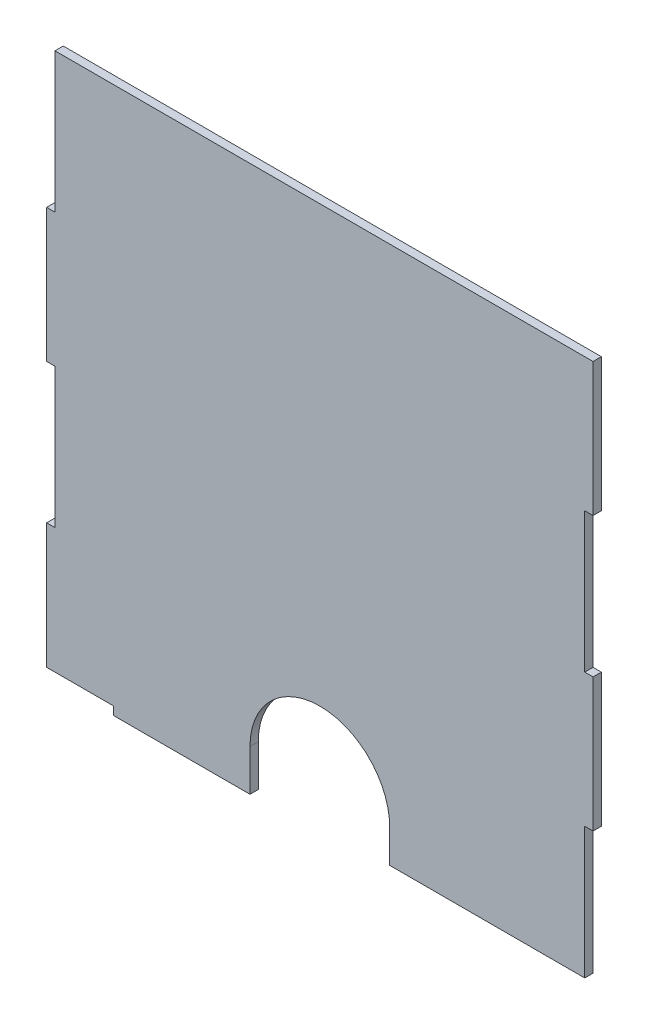
ISO-10303-21;
HEADER;
FILE_DESCRIPTION(('STEP AP214'),'2;1');
FILE_NAME('part.step','',(''),(''),'','','');
FILE_SCHEMA(('AUTOMOTIVE_DESIGN { 1 0 10303 214 1 1 1 1 }'));
ENDSEC;
DATA;
#1=APPLICATION_CONTEXT('core data for automotive mechanical design processes');
#2=APPLICATION_PROTOCOL_DEFINITION('international standard','automotive_design',2000,#1);
#3=PRODUCT_CONTEXT('',#1,'mechanical');
#4=PRODUCT('Part','Part','',(#3));
#5=PRODUCT_RELATED_PRODUCT_CATEGORY('part','',(#4));
#6=PRODUCT_DEFINITION_FORMATION('','',#4);
#7=PRODUCT_DEFINITION_CONTEXT('part definition',#1,'design');
#8=PRODUCT_DEFINITION('design','',#6,#7);
#9=PRODUCT_DEFINITION_SHAPE('','',#8);
#10=(LENGTH_UNIT() NAMED_UNIT(*) SI_UNIT(.MILLI.,.METRE.));
#11=(NAMED_UNIT(*) PLANE_ANGLE_UNIT() SI_UNIT($,.RADIAN.));
#12=(NAMED_UNIT(*) SI_UNIT($,.STERADIAN.) SOLID_ANGLE_UNIT());
#13=UNCERTAINTY_MEASURE_WITH_UNIT(LENGTH_MEASURE(1.E-05),#10,'distance_accuracy_value','');
#14=(GEOMETRIC_REPRESENTATION_CONTEXT(3) GLOBAL_UNCERTAINTY_ASSIGNED_CONTEXT((#13)) GLOBAL_UNIT_ASSIGNED_CONTEXT((#10,
#11,#12)) REPRESENTATION_CONTEXT('',''));
#15=CARTESIAN_POINT('',(0.,0.,0.));
#16=DIRECTION('',(0.,0.,1.));
#17=DIRECTION('',(1.,0.,0.));
#18=AXIS2_PLACEMENT_3D('',#15,#16,#17);
#19=CARTESIAN_POINT('',(0.,-167.5,6.));
#20=DIRECTION('',(0.,0.,-1.));
#21=DIRECTION('',(-1.,0.,0.));
#22=AXIS2_PLACEMENT_3D('',#19,#20,#21);
#23=CYLINDRICAL_SURFACE('',#22,50.4999999999999);
#24=CARTESIAN_POINT('',(0.,-167.5,0.));
#25=DIRECTION('',(0.,0.,1.));
#26=DIRECTION('',(1.,0.,0.));
#27=AXIS2_PLACEMENT_3D('',#24,#25,#26);
#28=CIRCLE('',#27,50.4999999999999);
#29=CARTESIAN_POINT('',(50.5,-167.5,0.));
#30=VERTEX_POINT('',#29);
#31=CARTESIAN_POINT('',(-50.5,-167.5,0.));
#32=VERTEX_POINT('',#31);
#33=EDGE_CURVE('E219',#30,#32,#28,.T.);
#34=ORIENTED_EDGE('',*,*,#33,.F.);
#35=DIRECTION('',(0.,0.,-1.));
#36=VECTOR('',#35,1.);
#37=CARTESIAN_POINT('',(50.5,-167.5,6.));
#38=LINE('',#37,#36);
#39=CARTESIAN_POINT('',(50.5,-167.5,6.));
#40=VERTEX_POINT('',#39);
#41=EDGE_CURVE('E11',#40,#30,#38,.T.);
#42=ORIENTED_EDGE('',*,*,#41,.F.);
#43=CARTESIAN_POINT('',(0.,-167.5,6.));
#44=DIRECTION('',(0.,0.,1.));
#45=DIRECTION('',(1.,0.,0.));
#46=AXIS2_PLACEMENT_3D('',#43,#44,#45);
#47=CIRCLE('',#46,50.4999999999999);
#48=CARTESIAN_POINT('',(-50.5,-167.5,6.));
#49=VERTEX_POINT('',#48);
#50=EDGE_CURVE('E272',#40,#49,#47,.T.);
#51=ORIENTED_EDGE('',*,*,#50,.T.);
#52=DIRECTION('',(0.,0.,-1.));
#53=VECTOR('',#52,1.);
#54=CARTESIAN_POINT('',(-50.5,-167.5,6.));
#55=LINE('',#54,#53);
#56=EDGE_CURVE('E133',#49,#32,#55,.T.);
#57=ORIENTED_EDGE('',*,*,#56,.T.);
#58=EDGE_LOOP('',(#34,#42,#51,#57));
#59=FACE_BOUND('',#58,.T.);
#60=ADVANCED_FACE('F41',(#59),#23,.F.);
#61=CARTESIAN_POINT('',(50.5,0.,6.));
#62=DIRECTION('',(-1.,0.,0.));
#63=DIRECTION('',(0.,0.,1.));
#64=AXIS2_PLACEMENT_3D('',#61,#62,#63);
#65=PLANE('',#64);
#66=DIRECTION('',(0.,1.,0.));
#67=VECTOR('',#66,1.);
#68=CARTESIAN_POINT('',(50.5,0.,0.));
#69=LINE('',#68,#67);
#70=CARTESIAN_POINT('',(50.5,-191.5,0.));
#71=VERTEX_POINT('',#70);
#72=EDGE_CURVE('E222',#71,#30,#69,.T.);
#73=ORIENTED_EDGE('',*,*,#72,.F.);
#74=DIRECTION('',(0.,0.,-1.));
#75=VECTOR('',#74,1.);
#76=CARTESIAN_POINT('',(50.5,-191.5,6.));
#77=LINE('',#76,#75);
#78=CARTESIAN_POINT('',(50.5,-191.5,6.));
#79=VERTEX_POINT('',#78);
#80=EDGE_CURVE('E49',#79,#71,#77,.T.);
#81=ORIENTED_EDGE('',*,*,#80,.F.);
#82=DIRECTION('',(0.,1.,0.));
#83=VECTOR('',#82,1.);
#84=CARTESIAN_POINT('',(50.5,0.,6.));
#85=LINE('',#84,#83);
#86=EDGE_CURVE('E325',#79,#40,#85,.T.);
#87=ORIENTED_EDGE('',*,*,#86,.T.);
#88=ORIENTED_EDGE('',*,*,#41,.T.);
#89=EDGE_LOOP('',(#73,#81,#87,#88));
#90=FACE_BOUND('',#89,.T.);
#91=ADVANCED_FACE('F324',(#90),#65,.T.);
#92=CARTESIAN_POINT('',(0.,-191.5,6.));
#93=DIRECTION('',(0.,1.,0.));
#94=DIRECTION('',(0.,0.,1.));
#95=AXIS2_PLACEMENT_3D('',#92,#93,#94);
#96=PLANE('',#95);
#97=DIRECTION('',(1.,0.,0.));
#98=VECTOR('',#97,1.);
#99=CARTESIAN_POINT('',(0.,-191.5,0.));
#100=LINE('',#99,#98);
#101=CARTESIAN_POINT('',(191.5,-191.5,0.));
#102=VERTEX_POINT('',#101);
#103=EDGE_CURVE('E225',#71,#102,#100,.T.);
#104=ORIENTED_EDGE('',*,*,#103,.T.);
#105=DIRECTION('',(0.,0.,-1.));
#106=VECTOR('',#105,1.);
#107=CARTESIAN_POINT('',(191.5,-191.5,6.));
#108=LINE('',#107,#106);
#109=CARTESIAN_POINT('',(191.5,-191.5,6.));
#110=VERTEX_POINT('',#109);
#111=EDGE_CURVE('E309',#110,#102,#108,.T.);
#112=ORIENTED_EDGE('',*,*,#111,.F.);
#113=DIRECTION('',(1.,0.,0.));
#114=VECTOR('',#113,1.);
#115=CARTESIAN_POINT('',(0.,-191.5,6.));
#116=LINE('',#115,#114);
#117=EDGE_CURVE('E316',#79,#110,#116,.T.);
#118=ORIENTED_EDGE('',*,*,#117,.F.);
#119=ORIENTED_EDGE('',*,*,#80,.T.);
#120=EDGE_LOOP('',(#104,#112,#118,#119));
#121=FACE_BOUND('',#120,.T.);
#122=ADVANCED_FACE('F314',(#121),#96,.F.);
#123=CARTESIAN_POINT('',(191.5,0.,6.));
#124=DIRECTION('',(-1.,0.,0.));
#125=DIRECTION('',(0.,0.,1.));
#126=AXIS2_PLACEMENT_3D('',#123,#124,#125);
#127=PLANE('',#126);
#128=DIRECTION('',(0.,1.,0.));
#129=VECTOR('',#128,1.);
#130=CARTESIAN_POINT('',(191.5,0.,0.));
#131=LINE('',#130,#129);
#132=CARTESIAN_POINT('',(191.5,-96.5,0.));
#133=VERTEX_POINT('',#132);
#134=EDGE_CURVE('E227',#102,#133,#131,.T.);
#135=ORIENTED_EDGE('',*,*,#134,.T.);
#136=DIRECTION('',(0.,0.,-1.));
#137=VECTOR('',#136,1.);
#138=CARTESIAN_POINT('',(191.5,-96.5,6.));
#139=LINE('',#138,#137);
#140=CARTESIAN_POINT('',(191.5,-96.5,6.));
#141=VERTEX_POINT('',#140);
#142=EDGE_CURVE('E307',#141,#133,#139,.T.);
#143=ORIENTED_EDGE('',*,*,#142,.F.);
#144=DIRECTION('',(0.,1.,0.));
#145=VECTOR('',#144,1.);
#146=CARTESIAN_POINT('',(191.5,0.,6.));
#147=LINE('',#146,#145);
#148=EDGE_CURVE('E333',#110,#141,#147,.T.);
#149=ORIENTED_EDGE('',*,*,#148,.F.);
#150=ORIENTED_EDGE('',*,*,#111,.T.);
#151=EDGE_LOOP('',(#135,#143,#149,#150));
#152=FACE_BOUND('',#151,.T.);
#153=ADVANCED_FACE('F400',(#152),#127,.F.);
#154=CARTESIAN_POINT('',(0.,-96.5,6.));
#155=DIRECTION('',(0.,-1.,0.));
#156=DIRECTION('',(0.,0.,-1.));
#157=AXIS2_PLACEMENT_3D('',#154,#155,#156);
#158=PLANE('',#157);
#159=DIRECTION('',(-1.,0.,0.));
#160=VECTOR('',#159,1.);
#161=CARTESIAN_POINT('',(0.,-96.5,0.));
#162=LINE('',#161,#160);
#163=CARTESIAN_POINT('',(197.5,-96.5,0.));
#164=VERTEX_POINT('',#163);
#165=EDGE_CURVE('E230',#164,#133,#162,.T.);
#166=ORIENTED_EDGE('',*,*,#165,.F.);
#167=DIRECTION('',(0.,0.,-1.));
#168=VECTOR('',#167,1.);
#169=CARTESIAN_POINT('',(197.5,-96.5,6.));
#170=LINE('',#169,#168);
#171=CARTESIAN_POINT('',(197.5,-96.5,6.));
#172=VERTEX_POINT('',#171);
#173=EDGE_CURVE('E305',#172,#164,#170,.T.);
#174=ORIENTED_EDGE('',*,*,#173,.F.);
#175=DIRECTION('',(-1.,0.,0.));
#176=VECTOR('',#175,1.);
#177=CARTESIAN_POINT('',(0.,-96.5,6.));
#178=LINE('',#177,#176);
#179=EDGE_CURVE('E335',#172,#141,#178,.T.);
#180=ORIENTED_EDGE('',*,*,#179,.T.);
#181=ORIENTED_EDGE('',*,*,#142,.T.);
#182=EDGE_LOOP('',(#166,#174,#180,#181));
#183=FACE_BOUND('',#182,.T.);
#184=ADVANCED_FACE('F405',(#183),#158,.T.);
#185=CARTESIAN_POINT('',(197.5,0.,6.));
#186=DIRECTION('',(-1.,0.,0.));
#187=DIRECTION('',(0.,0.,1.));
#188=AXIS2_PLACEMENT_3D('',#185,#186,#187);
#189=PLANE('',#188);
#190=DIRECTION('',(0.,1.,0.));
#191=VECTOR('',#190,1.);
#192=CARTESIAN_POINT('',(197.5,0.,0.));
#193=LINE('',#192,#191);
#194=CARTESIAN_POINT('',(197.5,0.,0.));
#195=VERTEX_POINT('',#194);
#196=EDGE_CURVE('E233',#164,#195,#193,.T.);
#197=ORIENTED_EDGE('',*,*,#196,.T.);
#198=DIRECTION('',(0.,0.,-1.));
#199=VECTOR('',#198,1.);
#200=CARTESIAN_POINT('',(197.5,0.,6.));
#201=LINE('',#200,#199);
#202=CARTESIAN_POINT('',(197.5,0.,6.));
#203=VERTEX_POINT('',#202);
#204=EDGE_CURVE('E302',#203,#195,#201,.T.);
#205=ORIENTED_EDGE('',*,*,#204,.F.);
#206=DIRECTION('',(0.,1.,0.));
#207=VECTOR('',#206,1.);
#208=CARTESIAN_POINT('',(197.5,0.,6.));
#209=LINE('',#208,#207);
#210=EDGE_CURVE('E338',#172,#203,#209,.T.);
#211=ORIENTED_EDGE('',*,*,#210,.F.);
#212=ORIENTED_EDGE('',*,*,#173,.T.);
#213=EDGE_LOOP('',(#197,#205,#211,#212));
#214=FACE_BOUND('',#213,.T.);
#215=ADVANCED_FACE('F409',(#214),#189,.F.);
#216=CARTESIAN_POINT('',(0.,0.,6.));
#217=DIRECTION('',(0.,-1.,0.));
#218=DIRECTION('',(0.,0.,-1.));
#219=AXIS2_PLACEMENT_3D('',#216,#217,#218);
#220=PLANE('',#219);
#221=DIRECTION('',(-1.,0.,0.));
#222=VECTOR('',#221,1.);
#223=CARTESIAN_POINT('',(0.,0.,0.));
#224=LINE('',#223,#222);
#225=CARTESIAN_POINT('',(191.5,0.,0.));
#226=VERTEX_POINT('',#225);
#227=EDGE_CURVE('E235',#195,#226,#224,.T.);
#228=ORIENTED_EDGE('',*,*,#227,.T.);
#229=DIRECTION('',(0.,0.,-1.));
#230=VECTOR('',#229,1.);
#231=CARTESIAN_POINT('',(191.5,0.,6.));
#232=LINE('',#231,#230);
#233=CARTESIAN_POINT('',(191.5,0.,6.));
#234=VERTEX_POINT('',#233);
#235=EDGE_CURVE('E299',#234,#226,#232,.T.);
#236=ORIENTED_EDGE('',*,*,#235,.F.);
#237=DIRECTION('',(-1.,0.,0.));
#238=VECTOR('',#237,1.);
#239=CARTESIAN_POINT('',(0.,0.,6.));
#240=LINE('',#239,#238);
#241=EDGE_CURVE('E340',#203,#234,#240,.T.);
#242=ORIENTED_EDGE('',*,*,#241,.F.);
#243=ORIENTED_EDGE('',*,*,#204,.T.);
#244=EDGE_LOOP('',(#228,#236,#242,#243));
#245=FACE_BOUND('',#244,.T.);
#246=ADVANCED_FACE('F411',(#245),#220,.F.);
#247=CARTESIAN_POINT('',(191.5,0.,6.));
#248=DIRECTION('',(-1.,0.,0.));
#249=DIRECTION('',(0.,0.,1.));
#250=AXIS2_PLACEMENT_3D('',#247,#248,#249);
#251=PLANE('',#250);
#252=DIRECTION('',(0.,1.,0.));
#253=VECTOR('',#252,1.);
#254=CARTESIAN_POINT('',(191.5,0.,0.));
#255=LINE('',#254,#253);
#256=CARTESIAN_POINT('',(191.5,101.,0.));
#257=VERTEX_POINT('',#256);
#258=EDGE_CURVE('E238',#226,#257,#255,.T.);
#259=ORIENTED_EDGE('',*,*,#258,.T.);
#260=DIRECTION('',(0.,0.,-1.));
#261=VECTOR('',#260,1.);
#262=CARTESIAN_POINT('',(191.5,101.,6.));
#263=LINE('',#262,#261);
#264=CARTESIAN_POINT('',(191.5,101.,6.));
#265=VERTEX_POINT('',#264);
#266=EDGE_CURVE('E297',#265,#257,#263,.T.);
#267=ORIENTED_EDGE('',*,*,#266,.F.);
#268=DIRECTION('',(0.,1.,0.));
#269=VECTOR('',#268,1.);
#270=CARTESIAN_POINT('',(191.5,0.,6.));
#271=LINE('',#270,#269);
#272=EDGE_CURVE('E343',#234,#265,#271,.T.);
#273=ORIENTED_EDGE('',*,*,#272,.F.);
#274=ORIENTED_EDGE('',*,*,#235,.T.);
#275=EDGE_LOOP('',(#259,#267,#273,#274));
#276=FACE_BOUND('',#275,.T.);
#277=ADVANCED_FACE('F414',(#276),#251,.F.);
#278=CARTESIAN_POINT('',(0.,101.,6.));
#279=DIRECTION('',(0.,-1.,0.));
#280=DIRECTION('',(0.,0.,-1.));
#281=AXIS2_PLACEMENT_3D('',#278,#279,#280);
#282=PLANE('',#281);
#283=DIRECTION('',(-1.,0.,0.));
#284=VECTOR('',#283,1.);
#285=CARTESIAN_POINT('',(0.,101.,0.));
#286=LINE('',#285,#284);
#287=CARTESIAN_POINT('',(197.5,101.,0.));
#288=VERTEX_POINT('',#287);
#289=EDGE_CURVE('E241',#288,#257,#286,.T.);
#290=ORIENTED_EDGE('',*,*,#289,.F.);
#291=DIRECTION('',(0.,0.,-1.));
#292=VECTOR('',#291,1.);
#293=CARTESIAN_POINT('',(197.5,101.,6.));
#294=LINE('',#293,#292);
#295=CARTESIAN_POINT('',(197.5,101.,6.));
#296=VERTEX_POINT('',#295);
#297=EDGE_CURVE('E295',#296,#288,#294,.T.);
#298=ORIENTED_EDGE('',*,*,#297,.F.);
#299=DIRECTION('',(-1.,0.,0.));
#300=VECTOR('',#299,1.);
#301=CARTESIAN_POINT('',(0.,101.,6.));
#302=LINE('',#301,#300);
#303=EDGE_CURVE('E345',#296,#265,#302,.T.);
#304=ORIENTED_EDGE('',*,*,#303,.T.);
#305=ORIENTED_EDGE('',*,*,#266,.T.);
#306=EDGE_LOOP('',(#290,#298,#304,#305));
#307=FACE_BOUND('',#306,.T.);
#308=ADVANCED_FACE('F418',(#307),#282,.T.);
#309=CARTESIAN_POINT('',(197.5,197.5,0.));
#310=VERTEX_POINT('',#309);
#311=EDGE_CURVE('E236',#288,#310,#193,.T.);
#312=ORIENTED_EDGE('',*,*,#311,.T.);
#313=DIRECTION('',(0.,0.,-1.));
#314=VECTOR('',#313,1.);
#315=CARTESIAN_POINT('',(197.5,197.5,6.));
#316=LINE('',#315,#314);
#317=CARTESIAN_POINT('',(197.5,197.5,6.));
#318=VERTEX_POINT('',#317);
#319=EDGE_CURVE('E293',#318,#310,#316,.T.);
#320=ORIENTED_EDGE('',*,*,#319,.F.);
#321=EDGE_CURVE('E341',#296,#318,#209,.T.);
#322=ORIENTED_EDGE('',*,*,#321,.F.);
#323=ORIENTED_EDGE('',*,*,#297,.T.);
#324=EDGE_LOOP('',(#312,#320,#322,#323));
#325=FACE_BOUND('',#324,.T.);
#326=ADVANCED_FACE('F422',(#325),#189,.F.);
#327=CARTESIAN_POINT('',(0.,197.5,6.));
#328=DIRECTION('',(0.,1.,0.));
#329=DIRECTION('',(0.,0.,1.));
#330=AXIS2_PLACEMENT_3D('',#327,#328,#329);
#331=PLANE('',#330);
#332=DIRECTION('',(1.,0.,0.));
#333=VECTOR('',#332,1.);
#334=CARTESIAN_POINT('',(0.,197.5,0.));
#335=LINE('',#334,#333);
#336=CARTESIAN_POINT('',(-191.5,197.5,0.));
#337=VERTEX_POINT('',#336);
#338=EDGE_CURVE('E244',#337,#310,#335,.T.);
#339=ORIENTED_EDGE('',*,*,#338,.F.);
#340=DIRECTION('',(0.,0.,-1.));
#341=VECTOR('',#340,1.);
#342=CARTESIAN_POINT('',(-191.5,197.5,6.));
#343=LINE('',#342,#341);
#344=CARTESIAN_POINT('',(-191.5,197.5,6.));
#345=VERTEX_POINT('',#344);
#346=EDGE_CURVE('E291',#345,#337,#343,.T.);
#347=ORIENTED_EDGE('',*,*,#346,.F.);
#348=DIRECTION('',(1.,0.,0.));
#349=VECTOR('',#348,1.);
#350=CARTESIAN_POINT('',(0.,197.5,6.));
#351=LINE('',#350,#349);
#352=EDGE_CURVE('E348',#345,#318,#351,.T.);
#353=ORIENTED_EDGE('',*,*,#352,.T.);
#354=ORIENTED_EDGE('',*,*,#319,.T.);
#355=EDGE_LOOP('',(#339,#347,#353,#354));
#356=FACE_BOUND('',#355,.T.);
#357=ADVANCED_FACE('F426',(#356),#331,.T.);
#358=CARTESIAN_POINT('',(-191.5,0.,6.));
#359=DIRECTION('',(1.,0.,0.));
#360=DIRECTION('',(0.,1.,0.));
#361=AXIS2_PLACEMENT_3D('',#358,#359,#360);
#362=PLANE('',#361);
#363=DIRECTION('',(0.,-1.,0.));
#364=VECTOR('',#363,1.);
#365=CARTESIAN_POINT('',(-191.5,0.,0.));
#366=LINE('',#365,#364);
#367=CARTESIAN_POINT('',(-191.5,96.4999999999999,0.));
#368=VERTEX_POINT('',#367);
#369=EDGE_CURVE('E247',#337,#368,#366,.T.);
#370=ORIENTED_EDGE('',*,*,#369,.T.);
#371=DIRECTION('',(0.,0.,-1.));
#372=VECTOR('',#371,1.);
#373=CARTESIAN_POINT('',(-191.5,96.4999999999999,6.));
#374=LINE('',#373,#372);
#375=CARTESIAN_POINT('',(-191.5,96.4999999999999,6.));
#376=VERTEX_POINT('',#375);
#377=EDGE_CURVE('E289',#376,#368,#374,.T.);
#378=ORIENTED_EDGE('',*,*,#377,.F.);
#379=DIRECTION('',(0.,-1.,0.));
#380=VECTOR('',#379,1.);
#381=CARTESIAN_POINT('',(-191.5,0.,6.));
#382=LINE('',#381,#380);
#383=EDGE_CURVE('E351',#345,#376,#382,.T.);
#384=ORIENTED_EDGE('',*,*,#383,.F.);
#385=ORIENTED_EDGE('',*,*,#346,.T.);
#386=EDGE_LOOP('',(#370,#378,#384,#385));
#387=FACE_BOUND('',#386,.T.);
#388=ADVANCED_FACE('F430',(#387),#362,.F.);
#389=CARTESIAN_POINT('',(0.,96.4999999999999,6.));
#390=DIRECTION('',(0.,1.,0.));
#391=DIRECTION('',(0.,0.,1.));
#392=AXIS2_PLACEMENT_3D('',#389,#390,#391);
#393=PLANE('',#392);
#394=DIRECTION('',(1.,0.,0.));
#395=VECTOR('',#394,1.);
#396=CARTESIAN_POINT('',(0.,96.4999999999999,0.));
#397=LINE('',#396,#395);
#398=CARTESIAN_POINT('',(-197.5,96.4999999999999,0.));
#399=VERTEX_POINT('',#398);
#400=EDGE_CURVE('E250',#399,#368,#397,.T.);
#401=ORIENTED_EDGE('',*,*,#400,.F.);
#402=DIRECTION('',(0.,0.,-1.));
#403=VECTOR('',#402,1.);
#404=CARTESIAN_POINT('',(-197.5,96.4999999999999,6.));
#405=LINE('',#404,#403);
#406=CARTESIAN_POINT('',(-197.5,96.4999999999999,6.));
#407=VERTEX_POINT('',#406);
#408=EDGE_CURVE('E287',#407,#399,#405,.T.);
#409=ORIENTED_EDGE('',*,*,#408,.F.);
#410=DIRECTION('',(1.,0.,0.));
#411=VECTOR('',#410,1.);
#412=CARTESIAN_POINT('',(0.,96.4999999999999,6.));
#413=LINE('',#412,#411);
#414=EDGE_CURVE('E353',#407,#376,#413,.T.);
#415=ORIENTED_EDGE('',*,*,#414,.T.);
#416=ORIENTED_EDGE('',*,*,#377,.T.);
#417=EDGE_LOOP('',(#401,#409,#415,#416));
#418=FACE_BOUND('',#417,.T.);
#419=ADVANCED_FACE('F434',(#418),#393,.T.);
#420=CARTESIAN_POINT('',(-197.5,0.,6.));
#421=DIRECTION('',(-1.,0.,0.));
#422=DIRECTION('',(0.,0.,1.));
#423=AXIS2_PLACEMENT_3D('',#420,#421,#422);
#424=PLANE('',#423);
#425=DIRECTION('',(0.,1.,0.));
#426=VECTOR('',#425,1.);
#427=CARTESIAN_POINT('',(-197.5,0.,0.));
#428=LINE('',#427,#426);
#429=CARTESIAN_POINT('',(-197.5,0.,0.));
#430=VERTEX_POINT('',#429);
#431=EDGE_CURVE('E253',#430,#399,#428,.T.);
#432=ORIENTED_EDGE('',*,*,#431,.F.);
#433=DIRECTION('',(0.,0.,-1.));
#434=VECTOR('',#433,1.);
#435=CARTESIAN_POINT('',(-197.5,0.,6.));
#436=LINE('',#435,#434);
#437=CARTESIAN_POINT('',(-197.5,0.,6.));
#438=VERTEX_POINT('',#437);
#439=EDGE_CURVE('E285',#438,#430,#436,.T.);
#440=ORIENTED_EDGE('',*,*,#439,.F.);
#441=DIRECTION('',(0.,1.,0.));
#442=VECTOR('',#441,1.);
#443=CARTESIAN_POINT('',(-197.5,0.,6.));
#444=LINE('',#443,#442);
#445=EDGE_CURVE('E356',#438,#407,#444,.T.);
#446=ORIENTED_EDGE('',*,*,#445,.T.);
#447=ORIENTED_EDGE('',*,*,#408,.T.);
#448=EDGE_LOOP('',(#432,#440,#446,#447));
#449=FACE_BOUND('',#448,.T.);
#450=ADVANCED_FACE('F392',(#449),#424,.T.);
#451=CARTESIAN_POINT('',(0.,0.,6.));
#452=DIRECTION('',(0.,1.,0.));
#453=DIRECTION('',(0.,0.,1.));
#454=AXIS2_PLACEMENT_3D('',#451,#452,#453);
#455=PLANE('',#454);
#456=DIRECTION('',(1.,0.,0.));
#457=VECTOR('',#456,1.);
#458=CARTESIAN_POINT('',(0.,0.,0.));
#459=LINE('',#458,#457);
#460=CARTESIAN_POINT('',(-191.5,0.,0.));
#461=VERTEX_POINT('',#460);
#462=EDGE_CURVE('E256',#430,#461,#459,.T.);
#463=ORIENTED_EDGE('',*,*,#462,.T.);
#464=DIRECTION('',(0.,0.,-1.));
#465=VECTOR('',#464,1.);
#466=CARTESIAN_POINT('',(-191.5,0.,6.));
#467=LINE('',#466,#465);
#468=CARTESIAN_POINT('',(-191.5,0.,6.));
#469=VERTEX_POINT('',#468);
#470=EDGE_CURVE('E282',#469,#461,#467,.T.);
#471=ORIENTED_EDGE('',*,*,#470,.F.);
#472=DIRECTION('',(1.,0.,0.));
#473=VECTOR('',#472,1.);
#474=CARTESIAN_POINT('',(0.,0.,6.));
#475=LINE('',#474,#473);
#476=EDGE_CURVE('E359',#438,#469,#475,.T.);
#477=ORIENTED_EDGE('',*,*,#476,.F.);
#478=ORIENTED_EDGE('',*,*,#439,.T.);
#479=EDGE_LOOP('',(#463,#471,#477,#478));
#480=FACE_BOUND('',#479,.T.);
#481=ADVANCED_FACE('F439',(#480),#455,.F.);
#482=CARTESIAN_POINT('',(-191.5,0.,6.));
#483=DIRECTION('',(1.,0.,0.));
#484=DIRECTION('',(0.,0.,-1.));
#485=AXIS2_PLACEMENT_3D('',#482,#483,#484);
#486=PLANE('',#485);
#487=DIRECTION('',(0.,-1.,0.));
#488=VECTOR('',#487,1.);
#489=CARTESIAN_POINT('',(-191.5,0.,0.));
#490=LINE('',#489,#488);
#491=CARTESIAN_POINT('',(-191.5,-101.,0.));
#492=VERTEX_POINT('',#491);
#493=EDGE_CURVE('E259',#461,#492,#490,.T.);
#494=ORIENTED_EDGE('',*,*,#493,.T.);
#495=DIRECTION('',(0.,0.,-1.));
#496=VECTOR('',#495,1.);
#497=CARTESIAN_POINT('',(-191.5,-101.,6.));
#498=LINE('',#497,#496);
#499=CARTESIAN_POINT('',(-191.5,-101.,6.));
#500=VERTEX_POINT('',#499);
#501=EDGE_CURVE('E280',#500,#492,#498,.T.);
#502=ORIENTED_EDGE('',*,*,#501,.F.);
#503=DIRECTION('',(0.,-1.,0.));
#504=VECTOR('',#503,1.);
#505=CARTESIAN_POINT('',(-191.5,0.,6.));
#506=LINE('',#505,#504);
#507=EDGE_CURVE('E361',#469,#500,#506,.T.);
#508=ORIENTED_EDGE('',*,*,#507,.F.);
#509=ORIENTED_EDGE('',*,*,#470,.T.);
#510=EDGE_LOOP('',(#494,#502,#508,#509));
#511=FACE_BOUND('',#510,.T.);
#512=ADVANCED_FACE('F377',(#511),#486,.F.);
#513=CARTESIAN_POINT('',(0.,-101.,6.));
#514=DIRECTION('',(0.,1.,0.));
#515=DIRECTION('',(0.,0.,1.));
#516=AXIS2_PLACEMENT_3D('',#513,#514,#515);
#517=PLANE('',#516);
#518=DIRECTION('',(1.,0.,0.));
#519=VECTOR('',#518,1.);
#520=CARTESIAN_POINT('',(0.,-101.,0.));
#521=LINE('',#520,#519);
#522=CARTESIAN_POINT('',(-197.5,-101.,0.));
#523=VERTEX_POINT('',#522);
#524=EDGE_CURVE('E262',#523,#492,#521,.T.);
#525=ORIENTED_EDGE('',*,*,#524,.F.);
#526=DIRECTION('',(0.,0.,-1.));
#527=VECTOR('',#526,1.);
#528=CARTESIAN_POINT('',(-197.5,-101.,6.));
#529=LINE('',#528,#527);
#530=CARTESIAN_POINT('',(-197.5,-101.,6.));
#531=VERTEX_POINT('',#530);
#532=EDGE_CURVE('E278',#531,#523,#529,.T.);
#533=ORIENTED_EDGE('',*,*,#532,.F.);
#534=DIRECTION('',(1.,0.,0.));
#535=VECTOR('',#534,1.);
#536=CARTESIAN_POINT('',(0.,-101.,6.));
#537=LINE('',#536,#535);
#538=EDGE_CURVE('E362',#531,#500,#537,.T.);
#539=ORIENTED_EDGE('',*,*,#538,.T.);
#540=ORIENTED_EDGE('',*,*,#501,.T.);
#541=EDGE_LOOP('',(#525,#533,#539,#540));
#542=FACE_BOUND('',#541,.T.);
#543=ADVANCED_FACE('F379',(#542),#517,.T.);
#544=CARTESIAN_POINT('',(-197.5,-191.5,0.));
#545=VERTEX_POINT('',#544);
#546=EDGE_CURVE('E257',#545,#523,#428,.T.);
#547=ORIENTED_EDGE('',*,*,#546,.F.);
#548=DIRECTION('',(0.,0.,-1.));
#549=VECTOR('',#548,1.);
#550=CARTESIAN_POINT('',(-197.5,-191.5,6.));
#551=LINE('',#550,#549);
#552=CARTESIAN_POINT('',(-197.5,-191.5,6.));
#553=VERTEX_POINT('',#552);
#554=EDGE_CURVE('E276',#553,#545,#551,.T.);
#555=ORIENTED_EDGE('',*,*,#554,.F.);
#556=EDGE_CURVE('E214',#553,#531,#444,.T.);
#557=ORIENTED_EDGE('',*,*,#556,.T.);
#558=ORIENTED_EDGE('',*,*,#532,.T.);
#559=EDGE_LOOP('',(#547,#555,#557,#558));
#560=FACE_BOUND('',#559,.T.);
#561=ADVANCED_FACE('F369',(#560),#424,.T.);
#562=CARTESIAN_POINT('',(0.,-191.5,6.));
#563=DIRECTION('',(0.,1.,0.));
#564=DIRECTION('',(0.,0.,1.));
#565=AXIS2_PLACEMENT_3D('',#562,#563,#564);
#566=PLANE('',#565);
#567=DIRECTION('',(1.,0.,0.));
#568=VECTOR('',#567,1.);
#569=CARTESIAN_POINT('',(0.,-191.5,0.));
#570=LINE('',#569,#568);
#571=CARTESIAN_POINT('',(-149.,-191.5,0.));
#572=VERTEX_POINT('',#571);
#573=EDGE_CURVE('E265',#545,#572,#570,.T.);
#574=ORIENTED_EDGE('',*,*,#573,.T.);
#575=DIRECTION('',(0.,0.,-1.));
#576=VECTOR('',#575,1.);
#577=CARTESIAN_POINT('',(-149.,-191.5,6.));
#578=LINE('',#577,#576);
#579=CARTESIAN_POINT('',(-149.,-191.5,6.));
#580=VERTEX_POINT('',#579);
#581=EDGE_CURVE('E202',#580,#572,#578,.T.);
#582=ORIENTED_EDGE('',*,*,#581,.F.);
#583=DIRECTION('',(1.,0.,0.));
#584=VECTOR('',#583,1.);
#585=CARTESIAN_POINT('',(0.,-191.5,6.));
#586=LINE('',#585,#584);
#587=EDGE_CURVE('E211',#553,#580,#586,.T.);
#588=ORIENTED_EDGE('',*,*,#587,.F.);
#589=ORIENTED_EDGE('',*,*,#554,.T.);
#590=EDGE_LOOP('',(#574,#582,#588,#589));
#591=FACE_BOUND('',#590,.T.);
#592=ADVANCED_FACE('F383',(#591),#566,.F.);
#593=CARTESIAN_POINT('',(-149.,0.,6.));
#594=DIRECTION('',(-1.,0.,0.));
#595=DIRECTION('',(0.,0.,1.));
#596=AXIS2_PLACEMENT_3D('',#593,#594,#595);
#597=PLANE('',#596);
#598=DIRECTION('',(0.,1.,0.));
#599=VECTOR('',#598,1.);
#600=CARTESIAN_POINT('',(-149.,0.,0.));
#601=LINE('',#600,#599);
#602=CARTESIAN_POINT('',(-149.,-197.5,0.));
#603=VERTEX_POINT('',#602);
#604=EDGE_CURVE('E201',#603,#572,#601,.T.);
#605=ORIENTED_EDGE('',*,*,#604,.F.);
#606=DIRECTION('',(0.,0.,-1.));
#607=VECTOR('',#606,1.);
#608=CARTESIAN_POINT('',(-149.,-197.5,6.));
#609=LINE('',#608,#607);
#610=CARTESIAN_POINT('',(-149.,-197.5,6.));
#611=VERTEX_POINT('',#610);
#612=EDGE_CURVE('E195',#611,#603,#609,.T.);
#613=ORIENTED_EDGE('',*,*,#612,.F.);
#614=DIRECTION('',(0.,1.,0.));
#615=VECTOR('',#614,1.);
#616=CARTESIAN_POINT('',(-149.,0.,6.));
#617=LINE('',#616,#615);
#618=EDGE_CURVE('E199',#611,#580,#617,.T.);
#619=ORIENTED_EDGE('',*,*,#618,.T.);
#620=ORIENTED_EDGE('',*,*,#581,.T.);
#621=EDGE_LOOP('',(#605,#613,#619,#620));
#622=FACE_BOUND('',#621,.T.);
#623=ADVANCED_FACE('F197',(#622),#597,.T.);
#624=CARTESIAN_POINT('',(0.,-197.5,6.));
#625=DIRECTION('',(0.,1.,0.));
#626=DIRECTION('',(0.,0.,1.));
#627=AXIS2_PLACEMENT_3D('',#624,#625,#626);
#628=PLANE('',#627);
#629=DIRECTION('',(1.,0.,0.));
#630=VECTOR('',#629,1.);
#631=CARTESIAN_POINT('',(0.,-197.5,0.));
#632=LINE('',#631,#630);
#633=CARTESIAN_POINT('',(-50.5,-197.5,0.));
#634=VERTEX_POINT('',#633);
#635=EDGE_CURVE('E126',#603,#634,#632,.T.);
#636=ORIENTED_EDGE('',*,*,#635,.T.);
#637=DIRECTION('',(0.,0.,-1.));
#638=VECTOR('',#637,1.);
#639=CARTESIAN_POINT('',(-50.5,-197.5,6.));
#640=LINE('',#639,#638);
#641=CARTESIAN_POINT('',(-50.5,-197.5,6.));
#642=VERTEX_POINT('',#641);
#643=EDGE_CURVE('E203',#642,#634,#640,.T.);
#644=ORIENTED_EDGE('',*,*,#643,.F.);
#645=DIRECTION('',(1.,0.,0.));
#646=VECTOR('',#645,1.);
#647=CARTESIAN_POINT('',(0.,-197.5,6.));
#648=LINE('',#647,#646);
#649=EDGE_CURVE('E205',#611,#642,#648,.T.);
#650=ORIENTED_EDGE('',*,*,#649,.F.);
#651=ORIENTED_EDGE('',*,*,#612,.T.);
#652=EDGE_LOOP('',(#636,#644,#650,#651));
#653=FACE_BOUND('',#652,.T.);
#654=ADVANCED_FACE('F206',(#653),#628,.F.);
#655=CARTESIAN_POINT('',(-50.5,0.,6.));
#656=DIRECTION('',(-1.,0.,0.));
#657=DIRECTION('',(0.,0.,1.));
#658=AXIS2_PLACEMENT_3D('',#655,#656,#657);
#659=PLANE('',#658);
#660=DIRECTION('',(0.,1.,0.));
#661=VECTOR('',#660,1.);
#662=CARTESIAN_POINT('',(-50.5,0.,0.));
#663=LINE('',#662,#661);
#664=EDGE_CURVE('E270',#634,#32,#663,.T.);
#665=ORIENTED_EDGE('',*,*,#664,.T.);
#666=ORIENTED_EDGE('',*,*,#56,.F.);
#667=DIRECTION('',(0.,1.,0.));
#668=VECTOR('',#667,1.);
#669=CARTESIAN_POINT('',(-50.5,0.,6.));
#670=LINE('',#669,#668);
#671=EDGE_CURVE('E57',#642,#49,#670,.T.);
#672=ORIENTED_EDGE('',*,*,#671,.F.);
#673=ORIENTED_EDGE('',*,*,#643,.T.);
#674=EDGE_LOOP('',(#665,#666,#672,#673));
#675=FACE_BOUND('',#674,.T.);
#676=ADVANCED_FACE('F328',(#675),#659,.F.);
#677=CARTESIAN_POINT('',(0.,0.,6.));
#678=DIRECTION('',(0.,0.,1.));
#679=DIRECTION('',(1.,0.,0.));
#680=AXIS2_PLACEMENT_3D('',#677,#678,#679);
#681=PLANE('',#680);
#682=ORIENTED_EDGE('',*,*,#50,.F.);
#683=ORIENTED_EDGE('',*,*,#86,.F.);
#684=ORIENTED_EDGE('',*,*,#117,.T.);
#685=ORIENTED_EDGE('',*,*,#148,.T.);
#686=ORIENTED_EDGE('',*,*,#179,.F.);
#687=ORIENTED_EDGE('',*,*,#210,.T.);
#688=ORIENTED_EDGE('',*,*,#241,.T.);
#689=ORIENTED_EDGE('',*,*,#272,.T.);
#690=ORIENTED_EDGE('',*,*,#303,.F.);
#691=ORIENTED_EDGE('',*,*,#321,.T.);
#692=ORIENTED_EDGE('',*,*,#352,.F.);
#693=ORIENTED_EDGE('',*,*,#383,.T.);
#694=ORIENTED_EDGE('',*,*,#414,.F.);
#695=ORIENTED_EDGE('',*,*,#445,.F.);
#696=ORIENTED_EDGE('',*,*,#476,.T.);
#697=ORIENTED_EDGE('',*,*,#507,.T.);
#698=ORIENTED_EDGE('',*,*,#538,.F.);
#699=ORIENTED_EDGE('',*,*,#556,.F.);
#700=ORIENTED_EDGE('',*,*,#587,.T.);
#701=ORIENTED_EDGE('',*,*,#618,.F.);
#702=ORIENTED_EDGE('',*,*,#649,.T.);
#703=ORIENTED_EDGE('',*,*,#671,.T.);
#704=EDGE_LOOP('',(#682,#683,#684,#685,#686,#687,#688,#689,#690,#691,#692,#693,#694,#695,#696,
#697,#698,#699,#700,#701,#702,#703));
#705=FACE_BOUND('',#704,.T.);
#706=ADVANCED_FACE('F208',(#705),#681,.T.);
#707=CARTESIAN_POINT('',(0.,0.,0.));
#708=DIRECTION('',(0.,0.,1.));
#709=DIRECTION('',(1.,0.,0.));
#710=AXIS2_PLACEMENT_3D('',#707,#708,#709);
#711=PLANE('',#710);
#712=ORIENTED_EDGE('',*,*,#33,.T.);
#713=ORIENTED_EDGE('',*,*,#664,.F.);
#714=ORIENTED_EDGE('',*,*,#635,.F.);
#715=ORIENTED_EDGE('',*,*,#604,.T.);
#716=ORIENTED_EDGE('',*,*,#573,.F.);
#717=ORIENTED_EDGE('',*,*,#546,.T.);
#718=ORIENTED_EDGE('',*,*,#524,.T.);
#719=ORIENTED_EDGE('',*,*,#493,.F.);
#720=ORIENTED_EDGE('',*,*,#462,.F.);
#721=ORIENTED_EDGE('',*,*,#431,.T.);
#722=ORIENTED_EDGE('',*,*,#400,.T.);
#723=ORIENTED_EDGE('',*,*,#369,.F.);
#724=ORIENTED_EDGE('',*,*,#338,.T.);
#725=ORIENTED_EDGE('',*,*,#311,.F.);
#726=ORIENTED_EDGE('',*,*,#289,.T.);
#727=ORIENTED_EDGE('',*,*,#258,.F.);
#728=ORIENTED_EDGE('',*,*,#227,.F.);
#729=ORIENTED_EDGE('',*,*,#196,.F.);
#730=ORIENTED_EDGE('',*,*,#165,.T.);
#731=ORIENTED_EDGE('',*,*,#134,.F.);
#732=ORIENTED_EDGE('',*,*,#103,.F.);
#733=ORIENTED_EDGE('',*,*,#72,.T.);
#734=EDGE_LOOP('',(#712,#713,#714,#715,#716,#717,#718,#719,#720,#721,#722,#723,#724,#725,#726,
#727,#728,#729,#730,#731,#732,#733));
#735=FACE_BOUND('',#734,.T.);
#736=ADVANCED_FACE('F323',(#735),#711,.F.);
#737=CLOSED_SHELL('',(#60,#91,#122,#153,#184,#215,#246,#277,#308,#326,#357,#388,#419,#450,#481,
#512,#543,#561,#592,#623,#654,#676,#706,#736));
#738=MANIFOLD_SOLID_BREP('B2',#737);
#739=ADVANCED_BREP_SHAPE_REPRESENTATION('',(#18,#738),#14);
#740=SHAPE_DEFINITION_REPRESENTATION(#9,#739);
ENDSEC;
END-ISO-10303-21;
